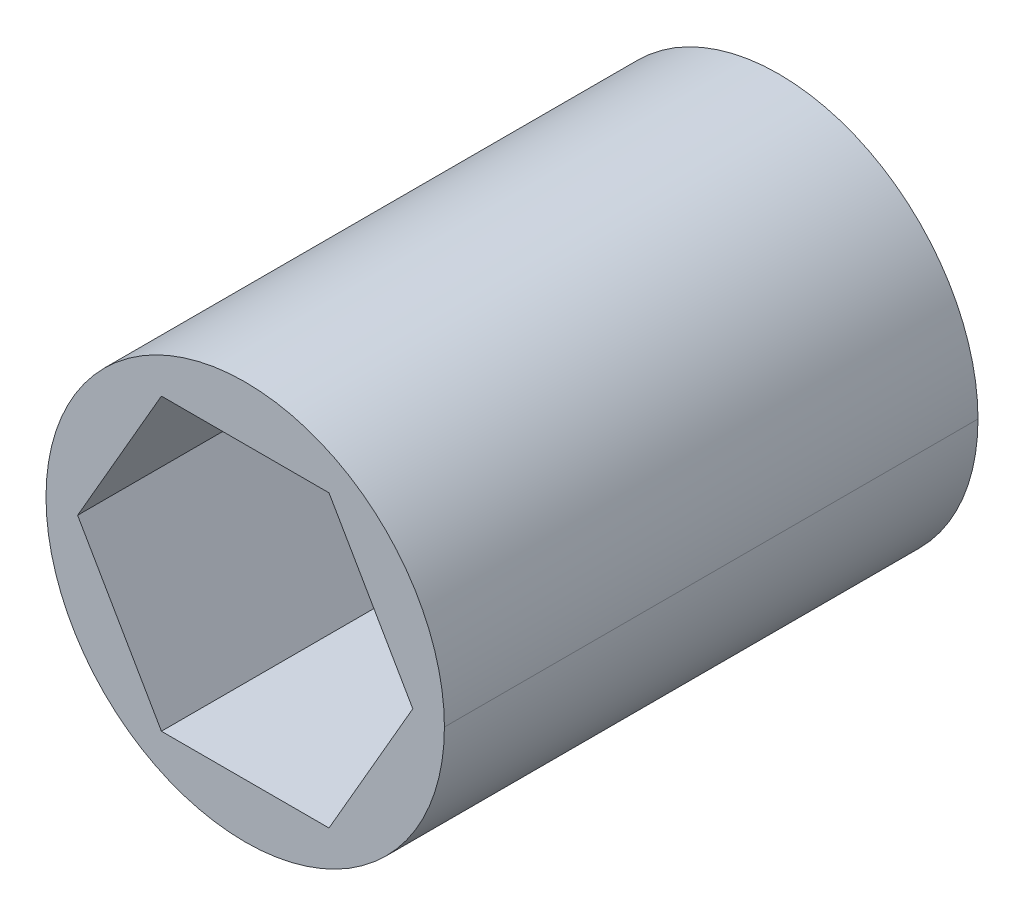
ISO-10303-21;
HEADER;
FILE_DESCRIPTION(('STEP AP214'),'2;1');
FILE_NAME('part.step','',(''),(''),'','','');
FILE_SCHEMA(('AUTOMOTIVE_DESIGN { 1 0 10303 214 1 1 1 1 }'));
ENDSEC;
DATA;
#1=APPLICATION_CONTEXT('core data for automotive mechanical design processes');
#2=APPLICATION_PROTOCOL_DEFINITION('international standard','automotive_design',2000,#1);
#3=PRODUCT_CONTEXT('',#1,'mechanical');
#4=PRODUCT('Part','Part','',(#3));
#5=PRODUCT_RELATED_PRODUCT_CATEGORY('part','',(#4));
#6=PRODUCT_DEFINITION_FORMATION('','',#4);
#7=PRODUCT_DEFINITION_CONTEXT('part definition',#1,'design');
#8=PRODUCT_DEFINITION('design','',#6,#7);
#9=PRODUCT_DEFINITION_SHAPE('','',#8);
#10=(LENGTH_UNIT() NAMED_UNIT(*) SI_UNIT(.MILLI.,.METRE.));
#11=(NAMED_UNIT(*) PLANE_ANGLE_UNIT() SI_UNIT($,.RADIAN.));
#12=(NAMED_UNIT(*) SI_UNIT($,.STERADIAN.) SOLID_ANGLE_UNIT());
#13=UNCERTAINTY_MEASURE_WITH_UNIT(LENGTH_MEASURE(1.E-05),#10,'distance_accuracy_value','');
#14=(GEOMETRIC_REPRESENTATION_CONTEXT(3) GLOBAL_UNCERTAINTY_ASSIGNED_CONTEXT((#13)) GLOBAL_UNIT_ASSIGNED_CONTEXT((#10,
#11,#12)) REPRESENTATION_CONTEXT('',''));
#15=CARTESIAN_POINT('',(0.,0.,0.));
#16=DIRECTION('',(0.,0.,1.));
#17=DIRECTION('',(1.,0.,0.));
#18=AXIS2_PLACEMENT_3D('',#15,#16,#17);
#19=CARTESIAN_POINT('',(-7.47899538708241,0.,11.90625));
#20=DIRECTION('',(0.866025403784439,0.5,0.));
#21=DIRECTION('',(0.,0.,-1.));
#22=AXIS2_PLACEMENT_3D('',#19,#20,#21);
#23=PLANE('',#22);
#24=DIRECTION('',(0.5,-0.866025403784439,0.));
#25=VECTOR('',#24,1.);
#26=CARTESIAN_POINT('',(-7.47899538708241,0.,-11.90625));
#27=LINE('',#26,#25);
#28=CARTESIAN_POINT('',(-7.47899538708241,0.,-11.90625));
#29=VERTEX_POINT('',#28);
#30=CARTESIAN_POINT('',(-3.7394976935412,-6.477,-11.90625));
#31=VERTEX_POINT('',#30);
#32=EDGE_CURVE('E104',#29,#31,#27,.T.);
#33=ORIENTED_EDGE('',*,*,#32,.F.);
#34=DIRECTION('',(0.,0.,-1.));
#35=VECTOR('',#34,1.);
#36=CARTESIAN_POINT('',(-7.47899538708241,0.,11.90625));
#37=LINE('',#36,#35);
#38=CARTESIAN_POINT('',(-7.47899538708241,0.,11.90625));
#39=VERTEX_POINT('',#38);
#40=EDGE_CURVE('E11',#39,#29,#37,.T.);
#41=ORIENTED_EDGE('',*,*,#40,.F.);
#42=DIRECTION('',(0.5,-0.866025403784439,0.));
#43=VECTOR('',#42,1.);
#44=CARTESIAN_POINT('',(-7.47899538708241,0.,11.90625));
#45=LINE('',#44,#43);
#46=CARTESIAN_POINT('',(-3.7394976935412,-6.477,11.90625));
#47=VERTEX_POINT('',#46);
#48=EDGE_CURVE('E101',#39,#47,#45,.T.);
#49=ORIENTED_EDGE('',*,*,#48,.T.);
#50=DIRECTION('',(0.,0.,-1.));
#51=VECTOR('',#50,1.);
#52=CARTESIAN_POINT('',(-3.7394976935412,-6.477,11.90625));
#53=LINE('',#52,#51);
#54=EDGE_CURVE('E94',#47,#31,#53,.T.);
#55=ORIENTED_EDGE('',*,*,#54,.T.);
#56=EDGE_LOOP('',(#33,#41,#49,#55));
#57=FACE_BOUND('',#56,.T.);
#58=ADVANCED_FACE('F16',(#57),#23,.T.);
#59=CARTESIAN_POINT('',(-3.7394976935412,6.477,11.90625));
#60=DIRECTION('',(0.866025403784439,-0.5,0.));
#61=DIRECTION('',(0.,0.,-1.));
#62=AXIS2_PLACEMENT_3D('',#59,#60,#61);
#63=PLANE('',#62);
#64=DIRECTION('',(-0.5,-0.866025403784439,0.));
#65=VECTOR('',#64,1.);
#66=CARTESIAN_POINT('',(-3.7394976935412,6.477,-11.90625));
#67=LINE('',#66,#65);
#68=CARTESIAN_POINT('',(-3.7394976935412,6.477,-11.90625));
#69=VERTEX_POINT('',#68);
#70=EDGE_CURVE('E186',#69,#29,#67,.T.);
#71=ORIENTED_EDGE('',*,*,#70,.F.);
#72=DIRECTION('',(0.,0.,-1.));
#73=VECTOR('',#72,1.);
#74=CARTESIAN_POINT('',(-3.7394976935412,6.477,11.90625));
#75=LINE('',#74,#73);
#76=CARTESIAN_POINT('',(-3.7394976935412,6.477,11.90625));
#77=VERTEX_POINT('',#76);
#78=EDGE_CURVE('E27',#77,#69,#75,.T.);
#79=ORIENTED_EDGE('',*,*,#78,.F.);
#80=DIRECTION('',(-0.5,-0.866025403784439,0.));
#81=VECTOR('',#80,1.);
#82=CARTESIAN_POINT('',(-3.7394976935412,6.477,11.90625));
#83=LINE('',#82,#81);
#84=EDGE_CURVE('E107',#77,#39,#83,.T.);
#85=ORIENTED_EDGE('',*,*,#84,.T.);
#86=ORIENTED_EDGE('',*,*,#40,.T.);
#87=EDGE_LOOP('',(#71,#79,#85,#86));
#88=FACE_BOUND('',#87,.T.);
#89=ADVANCED_FACE('F108',(#88),#63,.T.);
#90=CARTESIAN_POINT('',(3.7394976935412,6.477,11.90625));
#91=DIRECTION('',(0.,-1.,0.));
#92=DIRECTION('',(0.,0.,-1.));
#93=AXIS2_PLACEMENT_3D('',#90,#91,#92);
#94=PLANE('',#93);
#95=DIRECTION('',(-1.,0.,0.));
#96=VECTOR('',#95,1.);
#97=CARTESIAN_POINT('',(3.7394976935412,6.477,-11.90625));
#98=LINE('',#97,#96);
#99=CARTESIAN_POINT('',(3.7394976935412,6.477,-11.90625));
#100=VERTEX_POINT('',#99);
#101=EDGE_CURVE('E177',#100,#69,#98,.T.);
#102=ORIENTED_EDGE('',*,*,#101,.F.);
#103=DIRECTION('',(0.,0.,-1.));
#104=VECTOR('',#103,1.);
#105=CARTESIAN_POINT('',(3.7394976935412,6.477,11.90625));
#106=LINE('',#105,#104);
#107=CARTESIAN_POINT('',(3.7394976935412,6.477,11.90625));
#108=VERTEX_POINT('',#107);
#109=EDGE_CURVE('E133',#108,#100,#106,.T.);
#110=ORIENTED_EDGE('',*,*,#109,.F.);
#111=DIRECTION('',(-1.,0.,0.));
#112=VECTOR('',#111,1.);
#113=CARTESIAN_POINT('',(3.7394976935412,6.477,11.90625));
#114=LINE('',#113,#112);
#115=EDGE_CURVE('E113',#108,#77,#114,.T.);
#116=ORIENTED_EDGE('',*,*,#115,.T.);
#117=ORIENTED_EDGE('',*,*,#78,.T.);
#118=EDGE_LOOP('',(#102,#110,#116,#117));
#119=FACE_BOUND('',#118,.T.);
#120=ADVANCED_FACE('F298',(#119),#94,.T.);
#121=CARTESIAN_POINT('',(7.47899538708241,0.,11.90625));
#122=DIRECTION('',(-0.866025403784439,-0.5,0.));
#123=DIRECTION('',(-0.5,0.866025403784439,0.));
#124=AXIS2_PLACEMENT_3D('',#121,#122,#123);
#125=PLANE('',#124);
#126=DIRECTION('',(-0.5,0.866025403784439,0.));
#127=VECTOR('',#126,1.);
#128=CARTESIAN_POINT('',(7.47899538708241,0.,-11.90625));
#129=LINE('',#128,#127);
#130=CARTESIAN_POINT('',(7.47899538708241,0.,-11.90625));
#131=VERTEX_POINT('',#130);
#132=EDGE_CURVE('E20',#131,#100,#129,.T.);
#133=ORIENTED_EDGE('',*,*,#132,.F.);
#134=DIRECTION('',(0.,0.,-1.));
#135=VECTOR('',#134,1.);
#136=CARTESIAN_POINT('',(7.47899538708241,0.,11.90625));
#137=LINE('',#136,#135);
#138=CARTESIAN_POINT('',(7.47899538708241,0.,11.90625));
#139=VERTEX_POINT('',#138);
#140=EDGE_CURVE('E135',#139,#131,#137,.T.);
#141=ORIENTED_EDGE('',*,*,#140,.F.);
#142=DIRECTION('',(-0.5,0.866025403784439,0.));
#143=VECTOR('',#142,1.);
#144=CARTESIAN_POINT('',(7.47899538708241,0.,11.90625));
#145=LINE('',#144,#143);
#146=EDGE_CURVE('E139',#139,#108,#145,.T.);
#147=ORIENTED_EDGE('',*,*,#146,.T.);
#148=ORIENTED_EDGE('',*,*,#109,.T.);
#149=EDGE_LOOP('',(#133,#141,#147,#148));
#150=FACE_BOUND('',#149,.T.);
#151=ADVANCED_FACE('F204',(#150),#125,.T.);
#152=CARTESIAN_POINT('',(3.73949769354121,-6.477,11.90625));
#153=DIRECTION('',(-0.866025403784439,0.5,0.));
#154=DIRECTION('',(0.,0.,1.));
#155=AXIS2_PLACEMENT_3D('',#152,#153,#154);
#156=PLANE('',#155);
#157=DIRECTION('',(0.5,0.866025403784439,0.));
#158=VECTOR('',#157,1.);
#159=CARTESIAN_POINT('',(3.73949769354121,-6.477,-11.90625));
#160=LINE('',#159,#158);
#161=CARTESIAN_POINT('',(3.73949769354121,-6.477,-11.90625));
#162=VERTEX_POINT('',#161);
#163=EDGE_CURVE('E140',#162,#131,#160,.T.);
#164=ORIENTED_EDGE('',*,*,#163,.F.);
#165=DIRECTION('',(0.,0.,-1.));
#166=VECTOR('',#165,1.);
#167=CARTESIAN_POINT('',(3.73949769354121,-6.477,11.90625));
#168=LINE('',#167,#166);
#169=CARTESIAN_POINT('',(3.73949769354121,-6.477,11.90625));
#170=VERTEX_POINT('',#169);
#171=EDGE_CURVE('E155',#170,#162,#168,.T.);
#172=ORIENTED_EDGE('',*,*,#171,.F.);
#173=DIRECTION('',(0.5,0.866025403784439,0.));
#174=VECTOR('',#173,1.);
#175=CARTESIAN_POINT('',(3.73949769354121,-6.477,11.90625));
#176=LINE('',#175,#174);
#177=EDGE_CURVE('E126',#170,#139,#176,.T.);
#178=ORIENTED_EDGE('',*,*,#177,.T.);
#179=ORIENTED_EDGE('',*,*,#140,.T.);
#180=EDGE_LOOP('',(#164,#172,#178,#179));
#181=FACE_BOUND('',#180,.T.);
#182=ADVANCED_FACE('F200',(#181),#156,.T.);
#183=CARTESIAN_POINT('',(-3.7394976935412,-6.477,11.90625));
#184=DIRECTION('',(0.,1.,0.));
#185=DIRECTION('',(1.,0.,0.));
#186=AXIS2_PLACEMENT_3D('',#183,#184,#185);
#187=PLANE('',#186);
#188=DIRECTION('',(1.,0.,0.));
#189=VECTOR('',#188,1.);
#190=CARTESIAN_POINT('',(-3.7394976935412,-6.477,-11.90625));
#191=LINE('',#190,#189);
#192=EDGE_CURVE('E144',#31,#162,#191,.T.);
#193=ORIENTED_EDGE('',*,*,#192,.F.);
#194=ORIENTED_EDGE('',*,*,#54,.F.);
#195=DIRECTION('',(1.,0.,0.));
#196=VECTOR('',#195,1.);
#197=CARTESIAN_POINT('',(-3.7394976935412,-6.477,11.90625));
#198=LINE('',#197,#196);
#199=EDGE_CURVE('E118',#47,#170,#198,.T.);
#200=ORIENTED_EDGE('',*,*,#199,.T.);
#201=ORIENTED_EDGE('',*,*,#171,.T.);
#202=EDGE_LOOP('',(#193,#194,#200,#201));
#203=FACE_BOUND('',#202,.T.);
#204=ADVANCED_FACE('F211',(#203),#187,.T.);
#205=CARTESIAN_POINT('',(0.,0.,11.90625));
#206=DIRECTION('',(0.,0.,-1.));
#207=DIRECTION('',(-1.,0.,0.));
#208=AXIS2_PLACEMENT_3D('',#205,#206,#207);
#209=CYLINDRICAL_SURFACE('',#208,8.89);
#210=DIRECTION('',(0.,0.,-1.));
#211=VECTOR('',#210,1.);
#212=CARTESIAN_POINT('',(8.89,0.,11.90625));
#213=LINE('',#212,#211);
#214=CARTESIAN_POINT('',(8.89,0.,11.90625));
#215=VERTEX_POINT('',#214);
#216=CARTESIAN_POINT('',(8.89,0.,-11.90625));
#217=VERTEX_POINT('',#216);
#218=EDGE_CURVE('E145',#215,#217,#213,.T.);
#219=ORIENTED_EDGE('',*,*,#218,.F.);
#220=CARTESIAN_POINT('',(0.,0.,11.90625));
#221=DIRECTION('',(0.,0.,1.));
#222=DIRECTION('',(1.,0.,0.));
#223=AXIS2_PLACEMENT_3D('',#220,#221,#222);
#224=CIRCLE('',#223,8.89);
#225=CARTESIAN_POINT('',(-8.89,0.,11.90625));
#226=VERTEX_POINT('',#225);
#227=EDGE_CURVE('E152',#226,#215,#224,.T.);
#228=ORIENTED_EDGE('',*,*,#227,.F.);
#229=DIRECTION('',(0.,0.,-1.));
#230=VECTOR('',#229,1.);
#231=CARTESIAN_POINT('',(-8.89,0.,11.90625));
#232=LINE('',#231,#230);
#233=CARTESIAN_POINT('',(-8.89,0.,-11.90625));
#234=VERTEX_POINT('',#233);
#235=EDGE_CURVE('E156',#226,#234,#232,.T.);
#236=ORIENTED_EDGE('',*,*,#235,.T.);
#237=CARTESIAN_POINT('',(0.,0.,-11.90625));
#238=DIRECTION('',(0.,0.,1.));
#239=DIRECTION('',(1.,0.,0.));
#240=AXIS2_PLACEMENT_3D('',#237,#238,#239);
#241=CIRCLE('',#240,8.89);
#242=EDGE_CURVE('E182',#234,#217,#241,.T.);
#243=ORIENTED_EDGE('',*,*,#242,.T.);
#244=EDGE_LOOP('',(#219,#228,#236,#243));
#245=FACE_BOUND('',#244,.T.);
#246=ADVANCED_FACE('F18',(#245),#209,.T.);
#247=CARTESIAN_POINT('',(0.,0.,-11.90625));
#248=DIRECTION('',(0.,0.,1.));
#249=DIRECTION('',(1.,0.,0.));
#250=AXIS2_PLACEMENT_3D('',#247,#248,#249);
#251=PLANE('',#250);
#252=ORIENTED_EDGE('',*,*,#192,.T.);
#253=ORIENTED_EDGE('',*,*,#163,.T.);
#254=ORIENTED_EDGE('',*,*,#132,.T.);
#255=ORIENTED_EDGE('',*,*,#101,.T.);
#256=ORIENTED_EDGE('',*,*,#70,.T.);
#257=ORIENTED_EDGE('',*,*,#32,.T.);
#258=EDGE_LOOP('',(#252,#253,#254,#255,#256,#257));
#259=FACE_BOUND('',#258,.T.);
#260=ORIENTED_EDGE('',*,*,#242,.F.);
#261=CARTESIAN_POINT('',(0.,0.,-11.90625));
#262=DIRECTION('',(0.,0.,1.));
#263=DIRECTION('',(1.,0.,0.));
#264=AXIS2_PLACEMENT_3D('',#261,#262,#263);
#265=CIRCLE('',#264,8.89);
#266=EDGE_CURVE('E149',#217,#234,#265,.T.);
#267=ORIENTED_EDGE('',*,*,#266,.F.);
#268=EDGE_LOOP('',(#260,#267));
#269=FACE_BOUND('',#268,.T.);
#270=ADVANCED_FACE('F209',(#259,#269),#251,.F.);
#271=CARTESIAN_POINT('',(0.,0.,11.90625));
#272=DIRECTION('',(0.,0.,1.));
#273=DIRECTION('',(1.,0.,0.));
#274=AXIS2_PLACEMENT_3D('',#271,#272,#273);
#275=PLANE('',#274);
#276=ORIENTED_EDGE('',*,*,#177,.F.);
#277=ORIENTED_EDGE('',*,*,#199,.F.);
#278=ORIENTED_EDGE('',*,*,#48,.F.);
#279=ORIENTED_EDGE('',*,*,#84,.F.);
#280=ORIENTED_EDGE('',*,*,#115,.F.);
#281=ORIENTED_EDGE('',*,*,#146,.F.);
#282=EDGE_LOOP('',(#276,#277,#278,#279,#280,#281));
#283=FACE_BOUND('',#282,.T.);
#284=ORIENTED_EDGE('',*,*,#227,.T.);
#285=CARTESIAN_POINT('',(0.,0.,11.90625));
#286=DIRECTION('',(0.,0.,1.));
#287=DIRECTION('',(1.,0.,0.));
#288=AXIS2_PLACEMENT_3D('',#285,#286,#287);
#289=CIRCLE('',#288,8.89);
#290=EDGE_CURVE('E130',#215,#226,#289,.T.);
#291=ORIENTED_EDGE('',*,*,#290,.T.);
#292=EDGE_LOOP('',(#284,#291));
#293=FACE_BOUND('',#292,.T.);
#294=ADVANCED_FACE('F116',(#283,#293),#275,.T.);
#295=CARTESIAN_POINT('',(0.,0.,11.90625));
#296=DIRECTION('',(0.,0.,-1.));
#297=DIRECTION('',(-1.,0.,0.));
#298=AXIS2_PLACEMENT_3D('',#295,#296,#297);
#299=CYLINDRICAL_SURFACE('',#298,8.89);
#300=ORIENTED_EDGE('',*,*,#290,.F.);
#301=ORIENTED_EDGE('',*,*,#218,.T.);
#302=ORIENTED_EDGE('',*,*,#266,.T.);
#303=ORIENTED_EDGE('',*,*,#235,.F.);
#304=EDGE_LOOP('',(#300,#301,#302,#303));
#305=FACE_BOUND('',#304,.T.);
#306=ADVANCED_FACE('F226',(#305),#299,.T.);
#307=CLOSED_SHELL('',(#58,#89,#120,#151,#182,#204,#246,#270,#294,#306));
#308=MANIFOLD_SOLID_BREP('B1',#307);
#309=ADVANCED_BREP_SHAPE_REPRESENTATION('',(#18,#308),#14);
#310=SHAPE_DEFINITION_REPRESENTATION(#9,#309);
ENDSEC;
END-ISO-10303-21;
